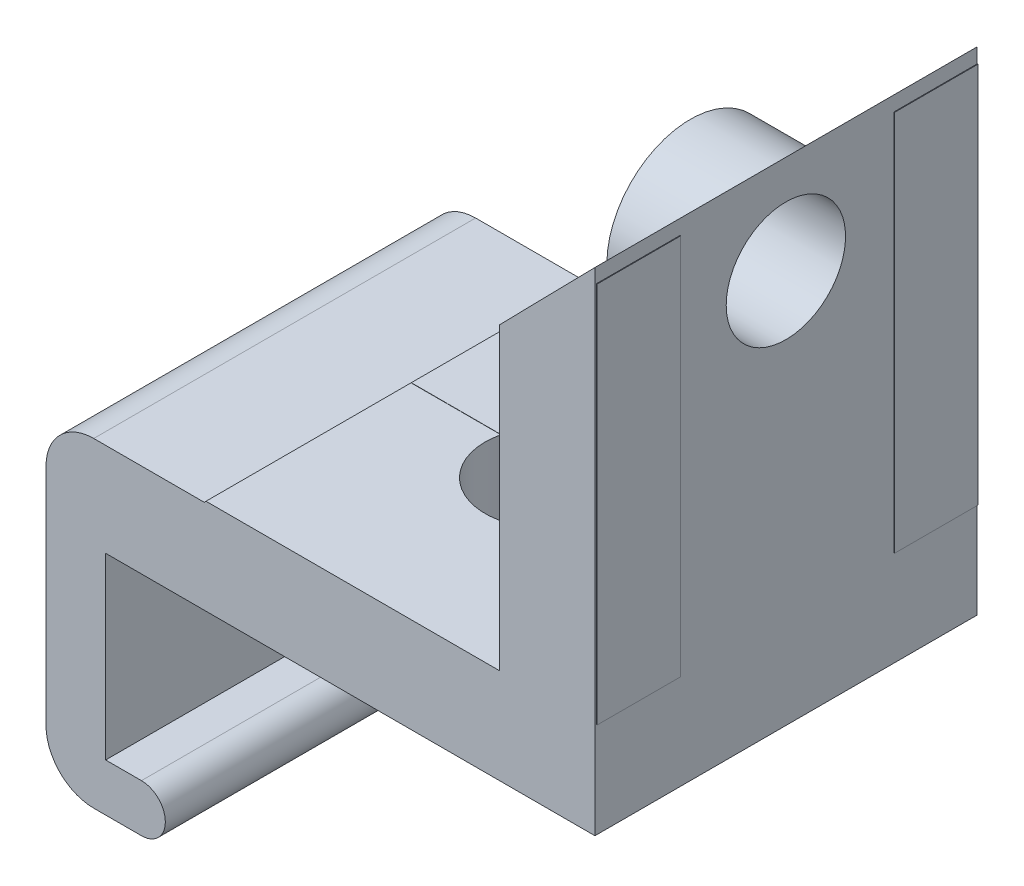
ISO-10303-21;
HEADER;
FILE_DESCRIPTION(('STEP AP214'),'2;1');
FILE_NAME('part.step','',(''),(''),'','','');
FILE_SCHEMA(('AUTOMOTIVE_DESIGN { 1 0 10303 214 1 1 1 1 }'));
ENDSEC;
DATA;
#1=APPLICATION_CONTEXT('core data for automotive mechanical design processes');
#2=APPLICATION_PROTOCOL_DEFINITION('international standard','automotive_design',2000,#1);
#3=PRODUCT_CONTEXT('',#1,'mechanical');
#4=PRODUCT('Part','Part','',(#3));
#5=PRODUCT_RELATED_PRODUCT_CATEGORY('part','',(#4));
#6=PRODUCT_DEFINITION_FORMATION('','',#4);
#7=PRODUCT_DEFINITION_CONTEXT('part definition',#1,'design');
#8=PRODUCT_DEFINITION('design','',#6,#7);
#9=PRODUCT_DEFINITION_SHAPE('','',#8);
#10=(LENGTH_UNIT() NAMED_UNIT(*) SI_UNIT(.MILLI.,.METRE.));
#11=(NAMED_UNIT(*) PLANE_ANGLE_UNIT() SI_UNIT($,.RADIAN.));
#12=(NAMED_UNIT(*) SI_UNIT($,.STERADIAN.) SOLID_ANGLE_UNIT());
#13=UNCERTAINTY_MEASURE_WITH_UNIT(LENGTH_MEASURE(1.E-05),#10,'distance_accuracy_value','');
#14=(GEOMETRIC_REPRESENTATION_CONTEXT(3) GLOBAL_UNCERTAINTY_ASSIGNED_CONTEXT((#13)) GLOBAL_UNIT_ASSIGNED_CONTEXT((#10,
#11,#12)) REPRESENTATION_CONTEXT('',''));
#15=CARTESIAN_POINT('',(0.,0.,0.));
#16=DIRECTION('',(0.,0.,1.));
#17=DIRECTION('',(1.,0.,0.));
#18=AXIS2_PLACEMENT_3D('',#15,#16,#17);
#19=CARTESIAN_POINT('',(15.9999999999999,24.,221.907730102539));
#20=DIRECTION('',(0.,0.,-1.));
#21=DIRECTION('',(-1.,0.,0.));
#22=AXIS2_PLACEMENT_3D('',#19,#20,#21);
#23=PLANE('',#22);
#24=DIRECTION('',(-1.,0.,0.));
#25=VECTOR('',#24,1.);
#26=CARTESIAN_POINT('',(15.9999999999999,24.,221.907730102539));
#27=LINE('',#26,#25);
#28=CARTESIAN_POINT('',(15.9999999999999,24.,221.907730102539));
#29=VERTEX_POINT('',#28);
#30=CARTESIAN_POINT('',(12.5316430176001,24.,221.907730102539));
#31=VERTEX_POINT('',#30);
#32=EDGE_CURVE('E324',#29,#31,#27,.T.);
#33=ORIENTED_EDGE('',*,*,#32,.T.);
#34=DIRECTION('',(0.,-1.,0.));
#35=VECTOR('',#34,1.);
#36=CARTESIAN_POINT('',(12.5316430176,19.9999999999991,221.907730102539));
#37=LINE('',#36,#35);
#38=CARTESIAN_POINT('',(12.5316430176001,23.9899396896362,221.907730102539));
#39=VERTEX_POINT('',#38);
#40=EDGE_CURVE('E40',#31,#39,#37,.T.);
#41=ORIENTED_EDGE('',*,*,#40,.T.);
#42=DIRECTION('',(-1.,0.,0.));
#43=VECTOR('',#42,1.);
#44=CARTESIAN_POINT('',(15.9999999999999,23.9899396896362,221.907730102539));
#45=LINE('',#44,#43);
#46=CARTESIAN_POINT('',(15.9999999999999,23.9899396896362,221.907730102539));
#47=VERTEX_POINT('',#46);
#48=EDGE_CURVE('E329',#47,#39,#45,.T.);
#49=ORIENTED_EDGE('',*,*,#48,.F.);
#50=DIRECTION('',(0.,-1.,0.));
#51=VECTOR('',#50,1.);
#52=CARTESIAN_POINT('',(15.9999999999999,24.,221.907730102539));
#53=LINE('',#52,#51);
#54=EDGE_CURVE('E336',#29,#47,#53,.T.);
#55=ORIENTED_EDGE('',*,*,#54,.F.);
#56=EDGE_LOOP('',(#33,#41,#49,#55));
#57=FACE_BOUND('',#56,.T.);
#58=ADVANCED_FACE('F32',(#57),#23,.F.);
#59=CARTESIAN_POINT('',(-3.00000000000005,24.,214.5));
#60=DIRECTION('',(0.,-1.,0.));
#61=DIRECTION('',(0.,0.,-1.));
#62=AXIS2_PLACEMENT_3D('',#59,#60,#61);
#63=PLANE('',#62);
#64=CARTESIAN_POINT('',(7.46835698240053,24.,221.907730102539));
#65=VERTEX_POINT('',#64);
#66=CARTESIAN_POINT('',(3.71235274023553,24.,221.907730102539));
#67=VERTEX_POINT('',#66);
#68=EDGE_CURVE('E328',#65,#67,#27,.T.);
#69=ORIENTED_EDGE('',*,*,#68,.F.);
#70=CARTESIAN_POINT('',(10.0000000000003,24.,222.5));
#71=DIRECTION('',(0.,-1.,0.));
#72=DIRECTION('',(0.,0.,-1.));
#73=AXIS2_PLACEMENT_3D('',#70,#71,#72);
#74=CIRCLE('',#73,2.6);
#75=EDGE_CURVE('E47',#65,#31,#74,.T.);
#76=ORIENTED_EDGE('',*,*,#75,.T.);
#77=ORIENTED_EDGE('',*,*,#32,.F.);
#78=DIRECTION('',(0.,0.,-1.));
#79=VECTOR('',#78,1.);
#80=CARTESIAN_POINT('',(16.,24.,214.5));
#81=LINE('',#80,#79);
#82=CARTESIAN_POINT('',(16.0000000000001,24.,217.976547241211));
#83=VERTEX_POINT('',#82);
#84=EDGE_CURVE('E252',#29,#83,#81,.T.);
#85=ORIENTED_EDGE('',*,*,#84,.T.);
#86=DIRECTION('',(-1.,0.,0.));
#87=VECTOR('',#86,1.);
#88=CARTESIAN_POINT('',(16.0000000000001,24.,217.976547241211));
#89=LINE('',#88,#87);
#90=CARTESIAN_POINT('',(3.71235274023568,24.,217.976547241211));
#91=VERTEX_POINT('',#90);
#92=EDGE_CURVE('E401',#83,#91,#89,.T.);
#93=ORIENTED_EDGE('',*,*,#92,.T.);
#94=DIRECTION('',(0.,0.,-1.));
#95=VECTOR('',#94,1.);
#96=CARTESIAN_POINT('',(3.71235274023556,24.,214.5));
#97=LINE('',#96,#95);
#98=EDGE_CURVE('E279',#67,#91,#97,.T.);
#99=ORIENTED_EDGE('',*,*,#98,.F.);
#100=EDGE_LOOP('',(#69,#76,#77,#85,#93,#99));
#101=FACE_BOUND('',#100,.T.);
#102=ADVANCED_FACE('F396',(#101),#63,.F.);
#103=CARTESIAN_POINT('',(16.,0.,0.));
#104=DIRECTION('',(-1.,0.,0.));
#105=DIRECTION('',(0.,0.,1.));
#106=AXIS2_PLACEMENT_3D('',#103,#104,#105);
#107=PLANE('',#106);
#108=DIRECTION('',(0.,0.,-1.));
#109=VECTOR('',#108,1.);
#110=CARTESIAN_POINT('',(16.,36.5392283411719,0.));
#111=LINE('',#110,#109);
#112=CARTESIAN_POINT('',(16.0000000000001,36.539228341172,230.5));
#113=VERTEX_POINT('',#112);
#114=CARTESIAN_POINT('',(16.0000000000001,36.539228341172,225.99978015556));
#115=VERTEX_POINT('',#114);
#116=EDGE_CURVE('E232',#113,#115,#111,.T.);
#117=ORIENTED_EDGE('',*,*,#116,.T.);
#118=CARTESIAN_POINT('',(16.0000000000001,36.5,222.5));
#119=DIRECTION('',(-1.,0.,0.));
#120=DIRECTION('',(0.,0.,1.));
#121=AXIS2_PLACEMENT_3D('',#118,#119,#120);
#122=CIRCLE('',#121,3.49999999999999);
#123=CARTESIAN_POINT('',(16.0000000000001,36.539228341172,219.00021984444));
#124=VERTEX_POINT('',#123);
#125=EDGE_CURVE('E221',#115,#124,#122,.T.);
#126=ORIENTED_EDGE('',*,*,#125,.T.);
#127=CARTESIAN_POINT('',(16.0000000000001,36.539228341172,217.976547241211));
#128=VERTEX_POINT('',#127);
#129=EDGE_CURVE('E235',#124,#128,#111,.T.);
#130=ORIENTED_EDGE('',*,*,#129,.T.);
#131=DIRECTION('',(0.,-1.,0.));
#132=VECTOR('',#131,1.);
#133=CARTESIAN_POINT('',(16.0000000000001,36.539228341172,217.976547241211));
#134=LINE('',#133,#132);
#135=EDGE_CURVE('E399',#128,#83,#134,.T.);
#136=ORIENTED_EDGE('',*,*,#135,.T.);
#137=ORIENTED_EDGE('',*,*,#84,.F.);
#138=ORIENTED_EDGE('',*,*,#54,.T.);
#139=DIRECTION('',(0.,0.,1.));
#140=VECTOR('',#139,1.);
#141=CARTESIAN_POINT('',(15.9999999999999,23.9899396896362,221.907730102539));
#142=LINE('',#141,#140);
#143=CARTESIAN_POINT('',(15.9999999999999,23.9899396896362,230.5));
#144=VERTEX_POINT('',#143);
#145=EDGE_CURVE('E334',#47,#144,#142,.T.);
#146=ORIENTED_EDGE('',*,*,#145,.T.);
#147=DIRECTION('',(0.,-1.,0.));
#148=VECTOR('',#147,1.);
#149=CARTESIAN_POINT('',(16.0000000000001,24.,230.5));
#150=LINE('',#149,#148);
#151=EDGE_CURVE('E240',#113,#144,#150,.T.);
#152=ORIENTED_EDGE('',*,*,#151,.F.);
#153=EDGE_LOOP('',(#117,#126,#130,#136,#137,#138,#146,#152));
#154=FACE_BOUND('',#153,.T.);
#155=CARTESIAN_POINT('',(16.,36.5,222.5));
#156=DIRECTION('',(-1.,0.,0.));
#157=DIRECTION('',(0.,0.,1.));
#158=AXIS2_PLACEMENT_3D('',#155,#156,#157);
#159=CIRCLE('',#158,2.49999999999999);
#160=CARTESIAN_POINT('',(16.,36.5,225.));
#161=VERTEX_POINT('',#160);
#162=EDGE_CURVE('E227',#161,#161,#159,.T.);
#163=ORIENTED_EDGE('',*,*,#162,.F.);
#164=EDGE_LOOP('',(#163));
#165=FACE_BOUND('',#164,.T.);
#166=ADVANCED_FACE('F237',(#154,#165),#107,.T.);
#167=CARTESIAN_POINT('',(20.,0.,0.));
#168=DIRECTION('',(-1.,0.,0.));
#169=DIRECTION('',(0.,0.,1.));
#170=AXIS2_PLACEMENT_3D('',#167,#168,#169);
#171=PLANE('',#170);
#172=DIRECTION('',(0.,1.,0.));
#173=VECTOR('',#172,1.);
#174=CARTESIAN_POINT('',(20.0000000000001,24.,226.933158874512));
#175=LINE('',#174,#173);
#176=CARTESIAN_POINT('',(20.0000000000001,24.,226.933158874512));
#177=VERTEX_POINT('',#176);
#178=CARTESIAN_POINT('',(20.0000000000001,40.,226.933158874512));
#179=VERTEX_POINT('',#178);
#180=EDGE_CURVE('E435',#177,#179,#175,.T.);
#181=ORIENTED_EDGE('',*,*,#180,.F.);
#182=DIRECTION('',(0.,0.,-1.));
#183=VECTOR('',#182,1.);
#184=CARTESIAN_POINT('',(20.0000000000001,24.,230.433158874512));
#185=LINE('',#184,#183);
#186=CARTESIAN_POINT('',(20.0000000000001,24.,230.433158874512));
#187=VERTEX_POINT('',#186);
#188=EDGE_CURVE('E417',#187,#177,#185,.T.);
#189=ORIENTED_EDGE('',*,*,#188,.F.);
#190=DIRECTION('',(0.,-1.,0.));
#191=VECTOR('',#190,1.);
#192=CARTESIAN_POINT('',(20.0000000000001,40.,230.433158874512));
#193=LINE('',#192,#191);
#194=CARTESIAN_POINT('',(20.0000000000001,40.,230.433158874512));
#195=VERTEX_POINT('',#194);
#196=EDGE_CURVE('E429',#195,#187,#193,.T.);
#197=ORIENTED_EDGE('',*,*,#196,.F.);
#198=DIRECTION('',(0.,0.,1.));
#199=VECTOR('',#198,1.);
#200=CARTESIAN_POINT('',(20.0000000000001,40.,226.933158874512));
#201=LINE('',#200,#199);
#202=EDGE_CURVE('E55',#179,#195,#201,.T.);
#203=ORIENTED_EDGE('',*,*,#202,.F.);
#204=EDGE_LOOP('',(#181,#189,#197,#203));
#205=FACE_BOUND('',#204,.T.);
#206=DIRECTION('',(0.,0.,1.));
#207=VECTOR('',#206,1.);
#208=CARTESIAN_POINT('',(20.0000000000001,40.,214.476547241211));
#209=LINE('',#208,#207);
#210=CARTESIAN_POINT('',(20.0000000000001,40.,214.5));
#211=VERTEX_POINT('',#210);
#212=CARTESIAN_POINT('',(20.0000000000001,40.,217.976547241211));
#213=VERTEX_POINT('',#212);
#214=EDGE_CURVE('E370',#211,#213,#209,.T.);
#215=ORIENTED_EDGE('',*,*,#214,.F.);
#216=DIRECTION('',(0.,1.,0.));
#217=VECTOR('',#216,1.);
#218=CARTESIAN_POINT('',(20.0000000000001,40.,214.5));
#219=LINE('',#218,#217);
#220=CARTESIAN_POINT('',(20.0000000000001,40.6211255753907,214.5));
#221=VERTEX_POINT('',#220);
#222=EDGE_CURVE('E346',#211,#221,#219,.T.);
#223=ORIENTED_EDGE('',*,*,#222,.T.);
#224=DIRECTION('',(0.,0.,-1.));
#225=VECTOR('',#224,1.);
#226=CARTESIAN_POINT('',(20.0000000000001,40.6211255753907,225.99978015556));
#227=LINE('',#226,#225);
#228=CARTESIAN_POINT('',(20.0000000000001,40.6211255753907,230.5));
#229=VERTEX_POINT('',#228);
#230=EDGE_CURVE('E241',#229,#221,#227,.T.);
#231=ORIENTED_EDGE('',*,*,#230,.F.);
#232=DIRECTION('',(0.,1.,0.));
#233=VECTOR('',#232,1.);
#234=CARTESIAN_POINT('',(20.0000000000001,40.6211255753907,230.5));
#235=LINE('',#234,#233);
#236=CARTESIAN_POINT('',(20.0000000000001,20.0000000000001,230.5));
#237=VERTEX_POINT('',#236);
#238=EDGE_CURVE('E306',#237,#229,#235,.T.);
#239=ORIENTED_EDGE('',*,*,#238,.F.);
#240=DIRECTION('',(0.,0.,1.));
#241=VECTOR('',#240,1.);
#242=CARTESIAN_POINT('',(20.0000000000001,20.,214.5));
#243=LINE('',#242,#241);
#244=CARTESIAN_POINT('',(20.0000000000001,20.,214.5));
#245=VERTEX_POINT('',#244);
#246=EDGE_CURVE('E294',#245,#237,#243,.T.);
#247=ORIENTED_EDGE('',*,*,#246,.F.);
#248=DIRECTION('',(0.,-1.,0.));
#249=VECTOR('',#248,1.);
#250=CARTESIAN_POINT('',(20.,24.,214.5));
#251=LINE('',#250,#249);
#252=CARTESIAN_POINT('',(20.,24.,214.5));
#253=VERTEX_POINT('',#252);
#254=EDGE_CURVE('E267',#253,#245,#251,.T.);
#255=ORIENTED_EDGE('',*,*,#254,.F.);
#256=DIRECTION('',(0.,0.,-1.));
#257=VECTOR('',#256,1.);
#258=CARTESIAN_POINT('',(20.0000000000001,24.,217.976547241211));
#259=LINE('',#258,#257);
#260=CARTESIAN_POINT('',(20.0000000000001,24.,217.976547241211));
#261=VERTEX_POINT('',#260);
#262=EDGE_CURVE('E351',#261,#253,#259,.T.);
#263=ORIENTED_EDGE('',*,*,#262,.F.);
#264=DIRECTION('',(0.,-1.,0.));
#265=VECTOR('',#264,1.);
#266=CARTESIAN_POINT('',(20.0000000000001,40.,217.976547241211));
#267=LINE('',#266,#265);
#268=EDGE_CURVE('E453',#213,#261,#267,.T.);
#269=ORIENTED_EDGE('',*,*,#268,.F.);
#270=EDGE_LOOP('',(#215,#223,#231,#239,#247,#255,#263,#269));
#271=FACE_BOUND('',#270,.T.);
#272=CARTESIAN_POINT('',(20.0000000000001,36.5,222.5));
#273=DIRECTION('',(-1.,0.,0.));
#274=DIRECTION('',(0.,0.,1.));
#275=AXIS2_PLACEMENT_3D('',#272,#273,#274);
#276=CIRCLE('',#275,2.49999999999999);
#277=CARTESIAN_POINT('',(20.0000000000001,36.5,225.));
#278=VERTEX_POINT('',#277);
#279=EDGE_CURVE('E793',#278,#278,#276,.T.);
#280=ORIENTED_EDGE('',*,*,#279,.T.);
#281=EDGE_LOOP('',(#280));
#282=FACE_BOUND('',#281,.T.);
#283=ADVANCED_FACE('F477',(#205,#271,#282),#171,.F.);
#284=CARTESIAN_POINT('',(16.,24.,214.5));
#285=DIRECTION('',(0.,0.,1.));
#286=DIRECTION('',(1.,0.,0.));
#287=AXIS2_PLACEMENT_3D('',#284,#285,#286);
#288=PLANE('',#287);
#289=DIRECTION('',(0.,-1.,0.));
#290=VECTOR('',#289,1.);
#291=CARTESIAN_POINT('',(-3.00000000000004,10.5,214.5));
#292=LINE('',#291,#290);
#293=CARTESIAN_POINT('',(-3.00000000000005,21.9162278175354,214.5));
#294=VERTEX_POINT('',#293);
#295=CARTESIAN_POINT('',(-3.00000000000004,12.5,214.5));
#296=VERTEX_POINT('',#295);
#297=EDGE_CURVE('E255',#294,#296,#292,.T.);
#298=ORIENTED_EDGE('',*,*,#297,.F.);
#299=CARTESIAN_POINT('',(-1.00000000000005,21.9162278175354,214.5));
#300=DIRECTION('',(0.,0.,1.));
#301=DIRECTION('',(1.,0.,0.));
#302=AXIS2_PLACEMENT_3D('',#299,#300,#301);
#303=CIRCLE('',#302,2.);
#304=CARTESIAN_POINT('',(-1.00000000000005,23.9162278175354,214.5));
#305=VERTEX_POINT('',#304);
#306=EDGE_CURVE('E510',#294,#305,#303,.F.);
#307=ORIENTED_EDGE('',*,*,#306,.T.);
#308=DIRECTION('',(-1.,0.,0.));
#309=VECTOR('',#308,1.);
#310=CARTESIAN_POINT('',(3.6302613227816,23.9162278175354,214.5));
#311=LINE('',#310,#309);
#312=CARTESIAN_POINT('',(3.6302613227816,23.9162278175354,214.5));
#313=VERTEX_POINT('',#312);
#314=EDGE_CURVE('E271',#313,#305,#311,.T.);
#315=ORIENTED_EDGE('',*,*,#314,.F.);
#316=DIRECTION('',(-0.699905438991362,-0.71423551890837,0.));
#317=VECTOR('',#316,1.);
#318=CARTESIAN_POINT('',(9.73167330214749,30.142561988386,214.5));
#319=LINE('',#318,#317);
#320=CARTESIAN_POINT('',(3.71235274023556,24.,214.5));
#321=VERTEX_POINT('',#320);
#322=EDGE_CURVE('E275',#321,#313,#319,.T.);
#323=ORIENTED_EDGE('',*,*,#322,.F.);
#324=DIRECTION('',(1.,0.,0.));
#325=VECTOR('',#324,1.);
#326=CARTESIAN_POINT('',(16.,24.,214.5));
#327=LINE('',#326,#325);
#328=EDGE_CURVE('E263',#321,#253,#327,.T.);
#329=ORIENTED_EDGE('',*,*,#328,.T.);
#330=ORIENTED_EDGE('',*,*,#254,.T.);
#331=DIRECTION('',(1.,0.,0.));
#332=VECTOR('',#331,1.);
#333=CARTESIAN_POINT('',(-0.499999999999898,20.0000000000001,214.5));
#334=LINE('',#333,#332);
#335=CARTESIAN_POINT('',(-0.499999999999898,20.0000000000001,214.5));
#336=VERTEX_POINT('',#335);
#337=EDGE_CURVE('E287',#336,#245,#334,.T.);
#338=ORIENTED_EDGE('',*,*,#337,.F.);
#339=DIRECTION('',(0.,-1.,0.));
#340=VECTOR('',#339,1.);
#341=CARTESIAN_POINT('',(-0.499999999999898,20.0000000000001,214.5));
#342=LINE('',#341,#340);
#343=CARTESIAN_POINT('',(-0.499999999999917,12.5000000000001,214.5));
#344=VERTEX_POINT('',#343);
#345=EDGE_CURVE('E280',#336,#344,#342,.T.);
#346=ORIENTED_EDGE('',*,*,#345,.T.);
#347=DIRECTION('',(1.,0.,0.));
#348=VECTOR('',#347,1.);
#349=CARTESIAN_POINT('',(-0.499999999999917,12.5000000000001,214.5));
#350=LINE('',#349,#348);
#351=CARTESIAN_POINT('',(1.00000000000008,12.5,214.5));
#352=VERTEX_POINT('',#351);
#353=EDGE_CURVE('E288',#344,#352,#350,.T.);
#354=ORIENTED_EDGE('',*,*,#353,.T.);
#355=CARTESIAN_POINT('',(1.00000000000008,11.5,214.5));
#356=DIRECTION('',(0.,0.,1.));
#357=DIRECTION('',(1.,0.,0.));
#358=AXIS2_PLACEMENT_3D('',#355,#356,#357);
#359=CIRCLE('',#358,1.00000000000003);
#360=CARTESIAN_POINT('',(1.00000000000008,10.5,214.5));
#361=VERTEX_POINT('',#360);
#362=EDGE_CURVE('E249',#352,#361,#359,.F.);
#363=ORIENTED_EDGE('',*,*,#362,.T.);
#364=DIRECTION('',(1.,0.,0.));
#365=VECTOR('',#364,1.);
#366=CARTESIAN_POINT('',(16.,10.5,214.5));
#367=LINE('',#366,#365);
#368=CARTESIAN_POINT('',(-1.00000000000004,10.5,214.5));
#369=VERTEX_POINT('',#368);
#370=EDGE_CURVE('E261',#369,#361,#367,.T.);
#371=ORIENTED_EDGE('',*,*,#370,.F.);
#372=CARTESIAN_POINT('',(-1.00000000000004,12.5,214.5));
#373=DIRECTION('',(0.,0.,1.));
#374=DIRECTION('',(1.,0.,0.));
#375=AXIS2_PLACEMENT_3D('',#372,#373,#374);
#376=CIRCLE('',#375,2.);
#377=EDGE_CURVE('E508',#369,#296,#376,.F.);
#378=ORIENTED_EDGE('',*,*,#377,.T.);
#379=EDGE_LOOP('',(#298,#307,#315,#323,#329,#330,#338,#346,#354,#363,#371,#378));
#380=FACE_BOUND('',#379,.T.);
#381=ADVANCED_FACE('F489',(#380),#288,.F.);
#382=CARTESIAN_POINT('',(20.0000000000001,10.5,214.476547241211));
#383=DIRECTION('',(0.,-1.,0.));
#384=DIRECTION('',(1.,0.,0.));
#385=AXIS2_PLACEMENT_3D('',#382,#383,#384);
#386=PLANE('',#385);
#387=DIRECTION('',(1.,0.,0.));
#388=VECTOR('',#387,1.);
#389=CARTESIAN_POINT('',(1.00000000000008,10.5,230.5));
#390=LINE('',#389,#388);
#391=CARTESIAN_POINT('',(-1.00000000000004,10.5,230.5));
#392=VERTEX_POINT('',#391);
#393=CARTESIAN_POINT('',(1.00000000000008,10.5,230.5));
#394=VERTEX_POINT('',#393);
#395=EDGE_CURVE('E321',#392,#394,#390,.T.);
#396=ORIENTED_EDGE('',*,*,#395,.F.);
#397=DIRECTION('',(0.,0.,1.));
#398=VECTOR('',#397,1.);
#399=CARTESIAN_POINT('',(-1.00000000000004,10.5,214.5));
#400=LINE('',#399,#398);
#401=EDGE_CURVE('E373',#392,#369,#400,.F.);
#402=ORIENTED_EDGE('',*,*,#401,.T.);
#403=ORIENTED_EDGE('',*,*,#370,.T.);
#404=DIRECTION('',(0.,0.,1.));
#405=VECTOR('',#404,1.);
#406=CARTESIAN_POINT('',(1.00000000000008,10.5,214.476547241211));
#407=LINE('',#406,#405);
#408=EDGE_CURVE('E268',#361,#394,#407,.T.);
#409=ORIENTED_EDGE('',*,*,#408,.T.);
#410=EDGE_LOOP('',(#396,#402,#403,#409));
#411=FACE_BOUND('',#410,.T.);
#412=ADVANCED_FACE('F515',(#411),#386,.T.);
#413=CARTESIAN_POINT('',(20.0000000000001,40.6211255753907,214.476547241211));
#414=DIRECTION('',(0.,0.,-1.));
#415=DIRECTION('',(-1.,0.,0.));
#416=AXIS2_PLACEMENT_3D('',#413,#414,#415);
#417=PLANE('',#416);
#418=DIRECTION('',(1.,0.,0.));
#419=VECTOR('',#418,1.);
#420=CARTESIAN_POINT('',(19.3913363911431,40.,214.476547241211));
#421=LINE('',#420,#419);
#422=CARTESIAN_POINT('',(19.3913363911431,40.,214.476547241211));
#423=VERTEX_POINT('',#422);
#424=CARTESIAN_POINT('',(20.02681016922,40.,214.476547241211));
#425=VERTEX_POINT('',#424);
#426=EDGE_CURVE('E347',#423,#425,#421,.T.);
#427=ORIENTED_EDGE('',*,*,#426,.T.);
#428=DIRECTION('',(0.,1.,0.));
#429=VECTOR('',#428,1.);
#430=CARTESIAN_POINT('',(20.02681016922,24.,214.476547241211));
#431=LINE('',#430,#429);
#432=CARTESIAN_POINT('',(20.02681016922,24.,214.476547241211));
#433=VERTEX_POINT('',#432);
#434=EDGE_CURVE('E445',#433,#425,#431,.T.);
#435=ORIENTED_EDGE('',*,*,#434,.F.);
#436=DIRECTION('',(1.,0.,0.));
#437=VECTOR('',#436,1.);
#438=CARTESIAN_POINT('',(16.,24.,214.476547241211));
#439=LINE('',#438,#437);
#440=CARTESIAN_POINT('',(3.71235274023568,24.,214.476547241211));
#441=VERTEX_POINT('',#440);
#442=EDGE_CURVE('E246',#441,#433,#439,.T.);
#443=ORIENTED_EDGE('',*,*,#442,.F.);
#444=DIRECTION('',(-0.699905438991362,-0.71423551890837,0.));
#445=VECTOR('',#444,1.);
#446=CARTESIAN_POINT('',(20.0000000000001,40.6211255753907,214.476547241211));
#447=LINE('',#446,#445);
#448=EDGE_CURVE('E244',#423,#441,#447,.T.);
#449=ORIENTED_EDGE('',*,*,#448,.F.);
#450=EDGE_LOOP('',(#427,#435,#443,#449));
#451=FACE_BOUND('',#450,.T.);
#452=ADVANCED_FACE('F469',(#451),#417,.T.);
#453=CARTESIAN_POINT('',(20.0000000000001,40.6211255753907,225.99978015556));
#454=DIRECTION('',(-0.71423551890837,0.699905438991362,0.));
#455=DIRECTION('',(-0.699905438991362,-0.71423551890837,0.));
#456=AXIS2_PLACEMENT_3D('',#453,#454,#455);
#457=PLANE('',#456);
#458=CARTESIAN_POINT('',(15.9615587175071,36.5,222.5));
#459=DIRECTION('',(-0.71423551890837,0.699905438991362,0.));
#460=DIRECTION('',(-0.699905438991362,-0.71423551890837,0.));
#461=AXIS2_PLACEMENT_3D('',#458,#459,#460);
#462=ELLIPSE('',#461,4.90034436448828,3.49999999999999);
#463=EDGE_CURVE('E11',#115,#124,#462,.T.);
#464=ORIENTED_EDGE('',*,*,#463,.F.);
#465=ORIENTED_EDGE('',*,*,#116,.F.);
#466=DIRECTION('',(-0.699905438991364,-0.714235518908368,0.));
#467=VECTOR('',#466,1.);
#468=CARTESIAN_POINT('',(16.0000000000001,36.539228341172,230.5));
#469=LINE('',#468,#467);
#470=EDGE_CURVE('E304',#229,#113,#469,.T.);
#471=ORIENTED_EDGE('',*,*,#470,.F.);
#472=ORIENTED_EDGE('',*,*,#230,.T.);
#473=DIRECTION('',(-0.699905438991372,-0.714235518908361,0.));
#474=VECTOR('',#473,1.);
#475=CARTESIAN_POINT('',(20.0000000000001,40.6211255753907,214.5));
#476=LINE('',#475,#474);
#477=CARTESIAN_POINT('',(19.3913363911431,40.,214.5));
#478=VERTEX_POINT('',#477);
#479=EDGE_CURVE('E343',#221,#478,#476,.T.);
#480=ORIENTED_EDGE('',*,*,#479,.T.);
#481=DIRECTION('',(0.,0.,1.));
#482=VECTOR('',#481,1.);
#483=CARTESIAN_POINT('',(19.3913363911431,40.,214.475547241211));
#484=LINE('',#483,#482);
#485=EDGE_CURVE('E339',#423,#478,#484,.T.);
#486=ORIENTED_EDGE('',*,*,#485,.F.);
#487=ORIENTED_EDGE('',*,*,#448,.T.);
#488=DIRECTION('',(0.,0.,-1.));
#489=VECTOR('',#488,1.);
#490=CARTESIAN_POINT('',(3.71235274023568,24.,217.976547241211));
#491=LINE('',#490,#489);
#492=EDGE_CURVE('E410',#321,#441,#491,.T.);
#493=ORIENTED_EDGE('',*,*,#492,.F.);
#494=ORIENTED_EDGE('',*,*,#322,.T.);
#495=DIRECTION('',(0.,0.,1.));
#496=VECTOR('',#495,1.);
#497=CARTESIAN_POINT('',(3.6302613227816,23.9162278175354,214.5));
#498=LINE('',#497,#496);
#499=CARTESIAN_POINT('',(3.63026132278172,23.9162278175354,230.5));
#500=VERTEX_POINT('',#499);
#501=EDGE_CURVE('E276',#313,#500,#498,.T.);
#502=ORIENTED_EDGE('',*,*,#501,.T.);
#503=DIRECTION('',(-0.699905438991362,-0.71423551890837,0.));
#504=VECTOR('',#503,1.);
#505=CARTESIAN_POINT('',(3.6302613227816,23.9162278175354,230.5));
#506=LINE('',#505,#504);
#507=CARTESIAN_POINT('',(3.70249427512822,23.9899396896362,230.5));
#508=VERTEX_POINT('',#507);
#509=EDGE_CURVE('E302',#508,#500,#506,.T.);
#510=ORIENTED_EDGE('',*,*,#509,.F.);
#511=DIRECTION('',(0.,0.,1.));
#512=VECTOR('',#511,1.);
#513=CARTESIAN_POINT('',(3.70249427512821,23.9899396896362,214.5));
#514=LINE('',#513,#512);
#515=CARTESIAN_POINT('',(3.70249427512821,23.9899396896362,221.907730102539));
#516=VERTEX_POINT('',#515);
#517=EDGE_CURVE('E257',#516,#508,#514,.T.);
#518=ORIENTED_EDGE('',*,*,#517,.F.);
#519=DIRECTION('',(-0.699905438991362,-0.71423551890837,0.));
#520=VECTOR('',#519,1.);
#521=CARTESIAN_POINT('',(3.6302613227816,23.9162278175354,221.907730102539));
#522=LINE('',#521,#520);
#523=EDGE_CURVE('E342',#67,#516,#522,.T.);
#524=ORIENTED_EDGE('',*,*,#523,.F.);
#525=ORIENTED_EDGE('',*,*,#98,.T.);
#526=DIRECTION('',(0.69990543899136,0.714235518908372,0.));
#527=VECTOR('',#526,1.);
#528=CARTESIAN_POINT('',(3.71235274023568,24.,217.976547241211));
#529=LINE('',#528,#527);
#530=EDGE_CURVE('E408',#91,#128,#529,.T.);
#531=ORIENTED_EDGE('',*,*,#530,.T.);
#532=ORIENTED_EDGE('',*,*,#129,.F.);
#533=EDGE_LOOP('',(#464,#465,#471,#472,#480,#486,#487,#493,#494,#502,#510,#518,#524,#525,#531,#532));
#534=FACE_BOUND('',#533,.T.);
#535=ADVANCED_FACE('F230',(#534),#457,.T.);
#536=CARTESIAN_POINT('',(16.,24.,214.476547241211));
#537=DIRECTION('',(0.,1.,-1.47933425793104E-13));
#538=DIRECTION('',(0.,1.47933425793104E-13,1.));
#539=AXIS2_PLACEMENT_3D('',#536,#537,#538);
#540=PLANE('',#539);
#541=ORIENTED_EDGE('',*,*,#442,.T.);
#542=DIRECTION('',(0.,0.,-1.));
#543=VECTOR('',#542,1.);
#544=CARTESIAN_POINT('',(20.02681016922,24.,217.976547241211));
#545=LINE('',#544,#543);
#546=CARTESIAN_POINT('',(20.02681016922,24.,217.976547241211));
#547=VERTEX_POINT('',#546);
#548=EDGE_CURVE('E448',#547,#433,#545,.T.);
#549=ORIENTED_EDGE('',*,*,#548,.F.);
#550=DIRECTION('',(1.,0.,0.));
#551=VECTOR('',#550,1.);
#552=CARTESIAN_POINT('',(3.62166064584091,24.,217.976547241211));
#553=LINE('',#552,#551);
#554=EDGE_CURVE('E350',#261,#547,#553,.T.);
#555=ORIENTED_EDGE('',*,*,#554,.F.);
#556=ORIENTED_EDGE('',*,*,#262,.T.);
#557=ORIENTED_EDGE('',*,*,#328,.F.);
#558=ORIENTED_EDGE('',*,*,#492,.T.);
#559=EDGE_LOOP('',(#541,#549,#555,#556,#557,#558));
#560=FACE_BOUND('',#559,.T.);
#561=ADVANCED_FACE('F483',(#560),#540,.F.);
#562=CARTESIAN_POINT('',(-3.00000000000004,0.,0.));
#563=DIRECTION('',(1.,0.,0.));
#564=DIRECTION('',(0.,1.,0.));
#565=AXIS2_PLACEMENT_3D('',#562,#563,#564);
#566=PLANE('',#565);
#567=DIRECTION('',(0.,-1.,0.));
#568=VECTOR('',#567,1.);
#569=CARTESIAN_POINT('',(-2.99999999999992,10.5,230.5));
#570=LINE('',#569,#568);
#571=CARTESIAN_POINT('',(-2.99999999999992,21.9162278175354,230.5));
#572=VERTEX_POINT('',#571);
#573=CARTESIAN_POINT('',(-2.99999999999992,12.5,230.5));
#574=VERTEX_POINT('',#573);
#575=EDGE_CURVE('E291',#572,#574,#570,.T.);
#576=ORIENTED_EDGE('',*,*,#575,.F.);
#577=DIRECTION('',(0.,0.,1.));
#578=VECTOR('',#577,1.);
#579=CARTESIAN_POINT('',(-3.00000000000005,21.9162278175353,0.));
#580=LINE('',#579,#578);
#581=EDGE_CURVE('E506',#572,#294,#580,.F.);
#582=ORIENTED_EDGE('',*,*,#581,.T.);
#583=ORIENTED_EDGE('',*,*,#297,.T.);
#584=DIRECTION('',(0.,0.,1.));
#585=VECTOR('',#584,1.);
#586=CARTESIAN_POINT('',(-3.00000000000004,12.5,230.5));
#587=LINE('',#586,#585);
#588=EDGE_CURVE('E503',#296,#574,#587,.T.);
#589=ORIENTED_EDGE('',*,*,#588,.T.);
#590=EDGE_LOOP('',(#576,#582,#583,#589));
#591=FACE_BOUND('',#590,.T.);
#592=ADVANCED_FACE('F524',(#591),#566,.F.);
#593=CARTESIAN_POINT('',(1.00000000000008,11.5,214.476547241211));
#594=DIRECTION('',(0.,0.,1.));
#595=DIRECTION('',(1.,0.,0.));
#596=AXIS2_PLACEMENT_3D('',#593,#594,#595);
#597=CYLINDRICAL_SURFACE('',#596,1.00000000000003);
#598=DIRECTION('',(0.,0.,1.));
#599=VECTOR('',#598,1.);
#600=CARTESIAN_POINT('',(1.00000000000008,12.5,214.476547241211));
#601=LINE('',#600,#599);
#602=CARTESIAN_POINT('',(1.00000000000008,12.5,230.5));
#603=VERTEX_POINT('',#602);
#604=EDGE_CURVE('E256',#352,#603,#601,.T.);
#605=ORIENTED_EDGE('',*,*,#604,.T.);
#606=CARTESIAN_POINT('',(1.00000000000008,11.5,230.5));
#607=DIRECTION('',(0.,0.,1.));
#608=DIRECTION('',(-1.,0.,0.));
#609=AXIS2_PLACEMENT_3D('',#606,#607,#608);
#610=CIRCLE('',#609,1.);
#611=EDGE_CURVE('E318',#394,#603,#610,.T.);
#612=ORIENTED_EDGE('',*,*,#611,.F.);
#613=ORIENTED_EDGE('',*,*,#408,.F.);
#614=ORIENTED_EDGE('',*,*,#362,.F.);
#615=EDGE_LOOP('',(#605,#612,#613,#614));
#616=FACE_BOUND('',#615,.T.);
#617=ADVANCED_FACE('F551',(#616),#597,.T.);
#618=CARTESIAN_POINT('',(3.6302613227816,23.9162278175354,214.5));
#619=DIRECTION('',(0.,-1.,0.));
#620=DIRECTION('',(0.,0.,-1.));
#621=AXIS2_PLACEMENT_3D('',#618,#619,#620);
#622=PLANE('',#621);
#623=ORIENTED_EDGE('',*,*,#314,.T.);
#624=DIRECTION('',(0.,0.,1.));
#625=VECTOR('',#624,1.);
#626=CARTESIAN_POINT('',(-1.00000000000005,23.9162278175354,214.5));
#627=LINE('',#626,#625);
#628=CARTESIAN_POINT('',(-1.00000000000005,23.9162278175354,230.5));
#629=VERTEX_POINT('',#628);
#630=EDGE_CURVE('E496',#305,#629,#627,.T.);
#631=ORIENTED_EDGE('',*,*,#630,.T.);
#632=DIRECTION('',(-1.,0.,0.));
#633=VECTOR('',#632,1.);
#634=CARTESIAN_POINT('',(-2.99999999999992,23.9162278175354,230.5));
#635=LINE('',#634,#633);
#636=EDGE_CURVE('E299',#500,#629,#635,.T.);
#637=ORIENTED_EDGE('',*,*,#636,.F.);
#638=ORIENTED_EDGE('',*,*,#501,.F.);
#639=EDGE_LOOP('',(#623,#631,#637,#638));
#640=FACE_BOUND('',#639,.T.);
#641=ADVANCED_FACE('F534',(#640),#622,.F.);
#642=CARTESIAN_POINT('',(0.,12.5000000000001,0.));
#643=DIRECTION('',(0.,-1.,0.));
#644=DIRECTION('',(1.,0.,0.));
#645=AXIS2_PLACEMENT_3D('',#642,#643,#644);
#646=PLANE('',#645);
#647=ORIENTED_EDGE('',*,*,#353,.F.);
#648=DIRECTION('',(0.,0.,-1.));
#649=VECTOR('',#648,1.);
#650=CARTESIAN_POINT('',(-0.499999999999917,12.5000000000001,225.99978015556));
#651=LINE('',#650,#649);
#652=CARTESIAN_POINT('',(-0.499999999999916,12.5,230.5));
#653=VERTEX_POINT('',#652);
#654=EDGE_CURVE('E284',#653,#344,#651,.T.);
#655=ORIENTED_EDGE('',*,*,#654,.F.);
#656=DIRECTION('',(-1.,0.,0.));
#657=VECTOR('',#656,1.);
#658=CARTESIAN_POINT('',(-0.499999999999916,12.5,230.5));
#659=LINE('',#658,#657);
#660=EDGE_CURVE('E315',#603,#653,#659,.T.);
#661=ORIENTED_EDGE('',*,*,#660,.F.);
#662=ORIENTED_EDGE('',*,*,#604,.F.);
#663=EDGE_LOOP('',(#647,#655,#661,#662));
#664=FACE_BOUND('',#663,.T.);
#665=ADVANCED_FACE('F549',(#664),#646,.F.);
#666=CARTESIAN_POINT('',(-0.499999999999898,20.0000000000001,225.99978015556));
#667=DIRECTION('',(-1.,0.,0.));
#668=DIRECTION('',(0.,-1.,0.));
#669=AXIS2_PLACEMENT_3D('',#666,#667,#668);
#670=PLANE('',#669);
#671=ORIENTED_EDGE('',*,*,#654,.T.);
#672=ORIENTED_EDGE('',*,*,#345,.F.);
#673=DIRECTION('',(0.,0.,-1.));
#674=VECTOR('',#673,1.);
#675=CARTESIAN_POINT('',(-0.499999999999898,20.0000000000001,225.99978015556));
#676=LINE('',#675,#674);
#677=CARTESIAN_POINT('',(-0.499999999999917,20.,230.5));
#678=VERTEX_POINT('',#677);
#679=EDGE_CURVE('E283',#678,#336,#676,.T.);
#680=ORIENTED_EDGE('',*,*,#679,.F.);
#681=DIRECTION('',(0.,1.,0.));
#682=VECTOR('',#681,1.);
#683=CARTESIAN_POINT('',(-0.499999999999917,20.,230.5));
#684=LINE('',#683,#682);
#685=EDGE_CURVE('E312',#653,#678,#684,.T.);
#686=ORIENTED_EDGE('',*,*,#685,.F.);
#687=EDGE_LOOP('',(#671,#672,#680,#686));
#688=FACE_BOUND('',#687,.T.);
#689=ADVANCED_FACE('F545',(#688),#670,.F.);
#690=CARTESIAN_POINT('',(0.,20.0000000000001,0.));
#691=DIRECTION('',(0.,-1.,0.));
#692=DIRECTION('',(1.,0.,0.));
#693=AXIS2_PLACEMENT_3D('',#690,#691,#692);
#694=PLANE('',#693);
#695=CARTESIAN_POINT('',(10.0000000000003,19.9999999999991,222.5));
#696=DIRECTION('',(0.,-1.,0.));
#697=DIRECTION('',(0.,0.,-1.));
#698=AXIS2_PLACEMENT_3D('',#695,#696,#697);
#699=CIRCLE('',#698,2.6);
#700=CARTESIAN_POINT('',(10.0000000000003,19.9999999999991,219.9));
#701=VERTEX_POINT('',#700);
#702=EDGE_CURVE('E403',#701,#701,#699,.T.);
#703=ORIENTED_EDGE('',*,*,#702,.F.);
#704=EDGE_LOOP('',(#703));
#705=FACE_BOUND('',#704,.T.);
#706=ORIENTED_EDGE('',*,*,#337,.T.);
#707=ORIENTED_EDGE('',*,*,#246,.T.);
#708=DIRECTION('',(1.,0.,0.));
#709=VECTOR('',#708,1.);
#710=CARTESIAN_POINT('',(20.0000000000001,20.0000000000001,230.5));
#711=LINE('',#710,#709);
#712=EDGE_CURVE('E309',#678,#237,#711,.T.);
#713=ORIENTED_EDGE('',*,*,#712,.F.);
#714=ORIENTED_EDGE('',*,*,#679,.T.);
#715=EDGE_LOOP('',(#706,#707,#713,#714));
#716=FACE_BOUND('',#715,.T.);
#717=ADVANCED_FACE('F542',(#705,#716),#694,.T.);
#718=CARTESIAN_POINT('',(1.00000000000008,11.5,230.5));
#719=DIRECTION('',(0.,0.,-1.));
#720=DIRECTION('',(-1.,0.,0.));
#721=AXIS2_PLACEMENT_3D('',#718,#719,#720);
#722=PLANE('',#721);
#723=ORIENTED_EDGE('',*,*,#636,.T.);
#724=CARTESIAN_POINT('',(-1.00000000000005,21.9162278175354,230.5));
#725=DIRECTION('',(0.,0.,-1.));
#726=DIRECTION('',(-1.,0.,0.));
#727=AXIS2_PLACEMENT_3D('',#724,#725,#726);
#728=CIRCLE('',#727,2.);
#729=EDGE_CURVE('E501',#629,#572,#728,.F.);
#730=ORIENTED_EDGE('',*,*,#729,.T.);
#731=ORIENTED_EDGE('',*,*,#575,.T.);
#732=CARTESIAN_POINT('',(-1.00000000000004,12.5,230.5));
#733=DIRECTION('',(0.,0.,-1.));
#734=DIRECTION('',(-1.,0.,0.));
#735=AXIS2_PLACEMENT_3D('',#732,#733,#734);
#736=CIRCLE('',#735,2.);
#737=EDGE_CURVE('E499',#574,#392,#736,.F.);
#738=ORIENTED_EDGE('',*,*,#737,.T.);
#739=ORIENTED_EDGE('',*,*,#395,.T.);
#740=ORIENTED_EDGE('',*,*,#611,.T.);
#741=ORIENTED_EDGE('',*,*,#660,.T.);
#742=ORIENTED_EDGE('',*,*,#685,.T.);
#743=ORIENTED_EDGE('',*,*,#712,.T.);
#744=ORIENTED_EDGE('',*,*,#238,.T.);
#745=ORIENTED_EDGE('',*,*,#470,.T.);
#746=ORIENTED_EDGE('',*,*,#151,.T.);
#747=DIRECTION('',(-1.,0.,0.));
#748=VECTOR('',#747,1.);
#749=CARTESIAN_POINT('',(15.9999999999999,23.9899396896362,230.5));
#750=LINE('',#749,#748);
#751=EDGE_CURVE('E323',#144,#508,#750,.T.);
#752=ORIENTED_EDGE('',*,*,#751,.T.);
#753=ORIENTED_EDGE('',*,*,#509,.T.);
#754=EDGE_LOOP('',(#723,#730,#731,#738,#739,#740,#741,#742,#743,#744,#745,#746,#752,#753));
#755=FACE_BOUND('',#754,.T.);
#756=ADVANCED_FACE('F527',(#755),#722,.F.);
#757=CARTESIAN_POINT('',(15.9999999999999,23.9899396896362,221.907730102539));
#758=DIRECTION('',(0.,-1.,0.));
#759=DIRECTION('',(1.,0.,0.));
#760=AXIS2_PLACEMENT_3D('',#757,#758,#759);
#761=PLANE('',#760);
#762=ORIENTED_EDGE('',*,*,#48,.T.);
#763=CARTESIAN_POINT('',(10.0000000000003,23.9899396896362,222.5));
#764=DIRECTION('',(0.,-1.,0.));
#765=DIRECTION('',(1.,0.,0.));
#766=AXIS2_PLACEMENT_3D('',#763,#764,#765);
#767=CIRCLE('',#766,2.6);
#768=CARTESIAN_POINT('',(7.46835698240053,23.9899396896362,221.907730102539));
#769=VERTEX_POINT('',#768);
#770=EDGE_CURVE('E389',#39,#769,#767,.T.);
#771=ORIENTED_EDGE('',*,*,#770,.T.);
#772=EDGE_CURVE('E327',#769,#516,#45,.T.);
#773=ORIENTED_EDGE('',*,*,#772,.T.);
#774=ORIENTED_EDGE('',*,*,#517,.T.);
#775=ORIENTED_EDGE('',*,*,#751,.F.);
#776=ORIENTED_EDGE('',*,*,#145,.F.);
#777=EDGE_LOOP('',(#762,#771,#773,#774,#775,#776));
#778=FACE_BOUND('',#777,.T.);
#779=ADVANCED_FACE('F388',(#778),#761,.F.);
#780=ORIENTED_EDGE('',*,*,#772,.F.);
#781=DIRECTION('',(0.,-1.,0.));
#782=VECTOR('',#781,1.);
#783=CARTESIAN_POINT('',(7.46835698240053,19.9999999999991,221.907730102539));
#784=LINE('',#783,#782);
#785=EDGE_CURVE('E372',#769,#65,#784,.F.);
#786=ORIENTED_EDGE('',*,*,#785,.T.);
#787=ORIENTED_EDGE('',*,*,#68,.T.);
#788=ORIENTED_EDGE('',*,*,#523,.T.);
#789=EDGE_LOOP('',(#780,#786,#787,#788));
#790=FACE_BOUND('',#789,.T.);
#791=ADVANCED_FACE('F562',(#790),#23,.F.);
#792=CARTESIAN_POINT('',(-1.00000000000005,21.9162278175354,214.5));
#793=DIRECTION('',(0.,0.,1.));
#794=DIRECTION('',(0.,-1.,0.));
#795=AXIS2_PLACEMENT_3D('',#792,#793,#794);
#796=CYLINDRICAL_SURFACE('',#795,2.);
#797=ORIENTED_EDGE('',*,*,#306,.F.);
#798=ORIENTED_EDGE('',*,*,#581,.F.);
#799=ORIENTED_EDGE('',*,*,#729,.F.);
#800=ORIENTED_EDGE('',*,*,#630,.F.);
#801=EDGE_LOOP('',(#797,#798,#799,#800));
#802=FACE_BOUND('',#801,.T.);
#803=ADVANCED_FACE('F532',(#802),#796,.T.);
#804=CARTESIAN_POINT('',(-1.00000000000004,12.5,0.));
#805=DIRECTION('',(0.,0.,-1.));
#806=DIRECTION('',(0.,1.,0.));
#807=AXIS2_PLACEMENT_3D('',#804,#805,#806);
#808=CYLINDRICAL_SURFACE('',#807,2.);
#809=ORIENTED_EDGE('',*,*,#377,.F.);
#810=ORIENTED_EDGE('',*,*,#401,.F.);
#811=ORIENTED_EDGE('',*,*,#737,.F.);
#812=ORIENTED_EDGE('',*,*,#588,.F.);
#813=EDGE_LOOP('',(#809,#810,#811,#812));
#814=FACE_BOUND('',#813,.T.);
#815=ADVANCED_FACE('F34',(#814),#808,.T.);
#816=CARTESIAN_POINT('',(19.3913363911431,40.,214.475547241211));
#817=DIRECTION('',(0.,-1.,0.));
#818=DIRECTION('',(1.,0.,0.));
#819=AXIS2_PLACEMENT_3D('',#816,#817,#818);
#820=PLANE('',#819);
#821=ORIENTED_EDGE('',*,*,#485,.T.);
#822=DIRECTION('',(1.,0.,0.));
#823=VECTOR('',#822,1.);
#824=CARTESIAN_POINT('',(19.3913363911431,40.,214.5));
#825=LINE('',#824,#823);
#826=EDGE_CURVE('E349',#478,#211,#825,.T.);
#827=ORIENTED_EDGE('',*,*,#826,.T.);
#828=ORIENTED_EDGE('',*,*,#214,.T.);
#829=DIRECTION('',(1.,0.,0.));
#830=VECTOR('',#829,1.);
#831=CARTESIAN_POINT('',(3.62166064584091,40.,217.976547241211));
#832=LINE('',#831,#830);
#833=CARTESIAN_POINT('',(20.02681016922,40.,217.976547241211));
#834=VERTEX_POINT('',#833);
#835=EDGE_CURVE('E354',#213,#834,#832,.T.);
#836=ORIENTED_EDGE('',*,*,#835,.T.);
#837=DIRECTION('',(0.,0.,1.));
#838=VECTOR('',#837,1.);
#839=CARTESIAN_POINT('',(20.02681016922,40.,214.476547241211));
#840=LINE('',#839,#838);
#841=EDGE_CURVE('E355',#425,#834,#840,.T.);
#842=ORIENTED_EDGE('',*,*,#841,.F.);
#843=ORIENTED_EDGE('',*,*,#426,.F.);
#844=EDGE_LOOP('',(#821,#827,#828,#836,#842,#843));
#845=FACE_BOUND('',#844,.T.);
#846=ADVANCED_FACE('F458',(#845),#820,.F.);
#847=CARTESIAN_POINT('',(0.,0.,214.5));
#848=DIRECTION('',(0.,0.,1.));
#849=DIRECTION('',(1.,0.,0.));
#850=AXIS2_PLACEMENT_3D('',#847,#848,#849);
#851=PLANE('',#850);
#852=ORIENTED_EDGE('',*,*,#826,.F.);
#853=ORIENTED_EDGE('',*,*,#479,.F.);
#854=ORIENTED_EDGE('',*,*,#222,.F.);
#855=EDGE_LOOP('',(#852,#853,#854));
#856=FACE_BOUND('',#855,.T.);
#857=ADVANCED_FACE('F475',(#856),#851,.F.);
#858=CARTESIAN_POINT('',(20.02681016922,0.,0.));
#859=DIRECTION('',(1.,0.,0.));
#860=DIRECTION('',(0.,0.,-1.));
#861=AXIS2_PLACEMENT_3D('',#858,#859,#860);
#862=PLANE('',#861);
#863=DIRECTION('',(0.,-1.,0.));
#864=VECTOR('',#863,1.);
#865=CARTESIAN_POINT('',(20.02681016922,40.,217.976547241211));
#866=LINE('',#865,#864);
#867=EDGE_CURVE('E442',#834,#547,#866,.T.);
#868=ORIENTED_EDGE('',*,*,#867,.T.);
#869=ORIENTED_EDGE('',*,*,#548,.T.);
#870=ORIENTED_EDGE('',*,*,#434,.T.);
#871=ORIENTED_EDGE('',*,*,#841,.T.);
#872=EDGE_LOOP('',(#868,#869,#870,#871));
#873=FACE_BOUND('',#872,.T.);
#874=ADVANCED_FACE('F465',(#873),#862,.T.);
#875=CARTESIAN_POINT('',(3.62166064584091,40.,217.976547241211));
#876=DIRECTION('',(0.,0.,1.));
#877=DIRECTION('',(1.,0.,0.));
#878=AXIS2_PLACEMENT_3D('',#875,#876,#877);
#879=PLANE('',#878);
#880=ORIENTED_EDGE('',*,*,#835,.F.);
#881=ORIENTED_EDGE('',*,*,#268,.T.);
#882=ORIENTED_EDGE('',*,*,#554,.T.);
#883=ORIENTED_EDGE('',*,*,#867,.F.);
#884=EDGE_LOOP('',(#880,#881,#882,#883));
#885=FACE_BOUND('',#884,.T.);
#886=ADVANCED_FACE('F461',(#885),#879,.T.);
#887=CARTESIAN_POINT('',(20.02681016922,0.,0.));
#888=DIRECTION('',(1.,0.,0.));
#889=DIRECTION('',(0.,0.,-1.));
#890=AXIS2_PLACEMENT_3D('',#887,#888,#889);
#891=PLANE('',#890);
#892=DIRECTION('',(0.,-1.,0.));
#893=VECTOR('',#892,1.);
#894=CARTESIAN_POINT('',(20.02681016922,40.,230.433158874512));
#895=LINE('',#894,#893);
#896=CARTESIAN_POINT('',(20.02681016922,40.,230.433158874512));
#897=VERTEX_POINT('',#896);
#898=CARTESIAN_POINT('',(20.02681016922,24.,230.433158874512));
#899=VERTEX_POINT('',#898);
#900=EDGE_CURVE('E413',#897,#899,#895,.T.);
#901=ORIENTED_EDGE('',*,*,#900,.T.);
#902=DIRECTION('',(0.,0.,-1.));
#903=VECTOR('',#902,1.);
#904=CARTESIAN_POINT('',(20.02681016922,24.,230.433158874512));
#905=LINE('',#904,#903);
#906=CARTESIAN_POINT('',(20.02681016922,24.,226.933158874512));
#907=VERTEX_POINT('',#906);
#908=EDGE_CURVE('E421',#899,#907,#905,.T.);
#909=ORIENTED_EDGE('',*,*,#908,.T.);
#910=DIRECTION('',(0.,1.,0.));
#911=VECTOR('',#910,1.);
#912=CARTESIAN_POINT('',(20.02681016922,24.,226.933158874512));
#913=LINE('',#912,#911);
#914=CARTESIAN_POINT('',(20.02681016922,40.,226.933158874512));
#915=VERTEX_POINT('',#914);
#916=EDGE_CURVE('E418',#907,#915,#913,.T.);
#917=ORIENTED_EDGE('',*,*,#916,.T.);
#918=DIRECTION('',(0.,0.,1.));
#919=VECTOR('',#918,1.);
#920=CARTESIAN_POINT('',(20.02681016922,40.,226.933158874512));
#921=LINE('',#920,#919);
#922=EDGE_CURVE('E414',#915,#897,#921,.T.);
#923=ORIENTED_EDGE('',*,*,#922,.T.);
#924=EDGE_LOOP('',(#901,#909,#917,#923));
#925=FACE_BOUND('',#924,.T.);
#926=ADVANCED_FACE('F594',(#925),#891,.T.);
#927=CARTESIAN_POINT('',(3.6216606458409,24.,230.433158874512));
#928=DIRECTION('',(0.,-1.,0.));
#929=DIRECTION('',(0.,0.,-1.));
#930=AXIS2_PLACEMENT_3D('',#927,#928,#929);
#931=PLANE('',#930);
#932=DIRECTION('',(1.,0.,0.));
#933=VECTOR('',#932,1.);
#934=CARTESIAN_POINT('',(3.6216606458409,24.,230.433158874512));
#935=LINE('',#934,#933);
#936=EDGE_CURVE('E431',#187,#899,#935,.T.);
#937=ORIENTED_EDGE('',*,*,#936,.F.);
#938=ORIENTED_EDGE('',*,*,#188,.T.);
#939=DIRECTION('',(1.,0.,0.));
#940=VECTOR('',#939,1.);
#941=CARTESIAN_POINT('',(3.6216606458409,24.,226.933158874512));
#942=LINE('',#941,#940);
#943=EDGE_CURVE('E428',#177,#907,#942,.T.);
#944=ORIENTED_EDGE('',*,*,#943,.T.);
#945=ORIENTED_EDGE('',*,*,#908,.F.);
#946=EDGE_LOOP('',(#937,#938,#944,#945));
#947=FACE_BOUND('',#946,.T.);
#948=ADVANCED_FACE('F596',(#947),#931,.T.);
#949=CARTESIAN_POINT('',(3.6216606458409,24.,226.933158874512));
#950=DIRECTION('',(0.,0.,-1.));
#951=DIRECTION('',(-1.,0.,0.));
#952=AXIS2_PLACEMENT_3D('',#949,#950,#951);
#953=PLANE('',#952);
#954=ORIENTED_EDGE('',*,*,#943,.F.);
#955=ORIENTED_EDGE('',*,*,#180,.T.);
#956=DIRECTION('',(1.,0.,0.));
#957=VECTOR('',#956,1.);
#958=CARTESIAN_POINT('',(3.6216606458409,40.,226.933158874512));
#959=LINE('',#958,#957);
#960=EDGE_CURVE('E434',#179,#915,#959,.T.);
#961=ORIENTED_EDGE('',*,*,#960,.T.);
#962=ORIENTED_EDGE('',*,*,#916,.F.);
#963=EDGE_LOOP('',(#954,#955,#961,#962));
#964=FACE_BOUND('',#963,.T.);
#965=ADVANCED_FACE('F601',(#964),#953,.T.);
#966=CARTESIAN_POINT('',(3.6216606458409,40.,226.933158874512));
#967=DIRECTION('',(0.,1.,0.));
#968=DIRECTION('',(0.,0.,1.));
#969=AXIS2_PLACEMENT_3D('',#966,#967,#968);
#970=PLANE('',#969);
#971=ORIENTED_EDGE('',*,*,#960,.F.);
#972=ORIENTED_EDGE('',*,*,#202,.T.);
#973=DIRECTION('',(1.,0.,0.));
#974=VECTOR('',#973,1.);
#975=CARTESIAN_POINT('',(3.6216606458409,40.,230.433158874512));
#976=LINE('',#975,#974);
#977=EDGE_CURVE('E432',#195,#897,#976,.T.);
#978=ORIENTED_EDGE('',*,*,#977,.T.);
#979=ORIENTED_EDGE('',*,*,#922,.F.);
#980=EDGE_LOOP('',(#971,#972,#978,#979));
#981=FACE_BOUND('',#980,.T.);
#982=ADVANCED_FACE('F589',(#981),#970,.T.);
#983=CARTESIAN_POINT('',(3.6216606458409,40.,230.433158874512));
#984=DIRECTION('',(0.,0.,1.));
#985=DIRECTION('',(1.,0.,0.));
#986=AXIS2_PLACEMENT_3D('',#983,#984,#985);
#987=PLANE('',#986);
#988=ORIENTED_EDGE('',*,*,#977,.F.);
#989=ORIENTED_EDGE('',*,*,#196,.T.);
#990=ORIENTED_EDGE('',*,*,#936,.T.);
#991=ORIENTED_EDGE('',*,*,#900,.F.);
#992=EDGE_LOOP('',(#988,#989,#990,#991));
#993=FACE_BOUND('',#992,.T.);
#994=ADVANCED_FACE('F580',(#993),#987,.T.);
#995=CARTESIAN_POINT('',(0.,0.,217.976547241211));
#996=DIRECTION('',(0.,0.,-1.));
#997=DIRECTION('',(-1.,0.,0.));
#998=AXIS2_PLACEMENT_3D('',#995,#996,#997);
#999=PLANE('',#998);
#1000=ORIENTED_EDGE('',*,*,#135,.F.);
#1001=ORIENTED_EDGE('',*,*,#530,.F.);
#1002=ORIENTED_EDGE('',*,*,#92,.F.);
#1003=EDGE_LOOP('',(#1000,#1001,#1002));
#1004=FACE_BOUND('',#1003,.T.);
#1005=ADVANCED_FACE('F577',(#1004),#999,.F.);
#1006=CARTESIAN_POINT('',(10.0000000000003,19.9999999999991,222.5));
#1007=DIRECTION('',(0.,-1.,0.));
#1008=DIRECTION('',(0.,0.,-1.));
#1009=AXIS2_PLACEMENT_3D('',#1006,#1007,#1008);
#1010=CYLINDRICAL_SURFACE('',#1009,2.6);
#1011=ORIENTED_EDGE('',*,*,#702,.T.);
#1012=EDGE_LOOP('',(#1011));
#1013=FACE_BOUND('',#1012,.T.);
#1014=ORIENTED_EDGE('',*,*,#75,.F.);
#1015=ORIENTED_EDGE('',*,*,#785,.F.);
#1016=ORIENTED_EDGE('',*,*,#770,.F.);
#1017=ORIENTED_EDGE('',*,*,#40,.F.);
#1018=EDGE_LOOP('',(#1014,#1015,#1016,#1017));
#1019=FACE_BOUND('',#1018,.T.);
#1020=ADVANCED_FACE('F579',(#1013,#1019),#1010,.F.);
#1021=CARTESIAN_POINT('',(16.,36.5,222.5));
#1022=DIRECTION('',(-1.,0.,0.));
#1023=DIRECTION('',(0.,0.,1.));
#1024=AXIS2_PLACEMENT_3D('',#1021,#1022,#1023);
#1025=CYLINDRICAL_SURFACE('',#1024,2.49999999999999);
#1026=ORIENTED_EDGE('',*,*,#162,.T.);
#1027=EDGE_LOOP('',(#1026));
#1028=FACE_BOUND('',#1027,.T.);
#1029=ORIENTED_EDGE('',*,*,#279,.F.);
#1030=EDGE_LOOP('',(#1029));
#1031=FACE_BOUND('',#1030,.T.);
#1032=ADVANCED_FACE('F586',(#1028,#1031),#1025,.F.);
#1033=CARTESIAN_POINT('',(29.8994949366118,36.5,222.5));
#1034=DIRECTION('',(-1.,0.,0.));
#1035=DIRECTION('',(0.,0.,1.));
#1036=AXIS2_PLACEMENT_3D('',#1033,#1034,#1035);
#1037=CYLINDRICAL_SURFACE('',#1036,3.49999999999999);
#1038=ORIENTED_EDGE('',*,*,#125,.F.);
#1039=ORIENTED_EDGE('',*,*,#463,.T.);
#1040=EDGE_LOOP('',(#1038,#1039));
#1041=FACE_BOUND('',#1040,.T.);
#1042=ADVANCED_FACE('F223',(#1041),#1037,.T.);
#1043=CLOSED_SHELL('',(#58,#102,#166,#283,#381,#412,#452,#535,#561,#592,#617,#641,#665,#689,
#717,#756,#779,#791,#803,#815,#846,#857,#874,#886,#926,#948,#965,#982,#994,#1005,#1020,#1032,#1042));
#1044=MANIFOLD_SOLID_BREP('B2',#1043);
#1045=ADVANCED_BREP_SHAPE_REPRESENTATION('',(#18,#1044),#14);
#1046=SHAPE_DEFINITION_REPRESENTATION(#9,#1045);
ENDSEC;
END-ISO-10303-21;
